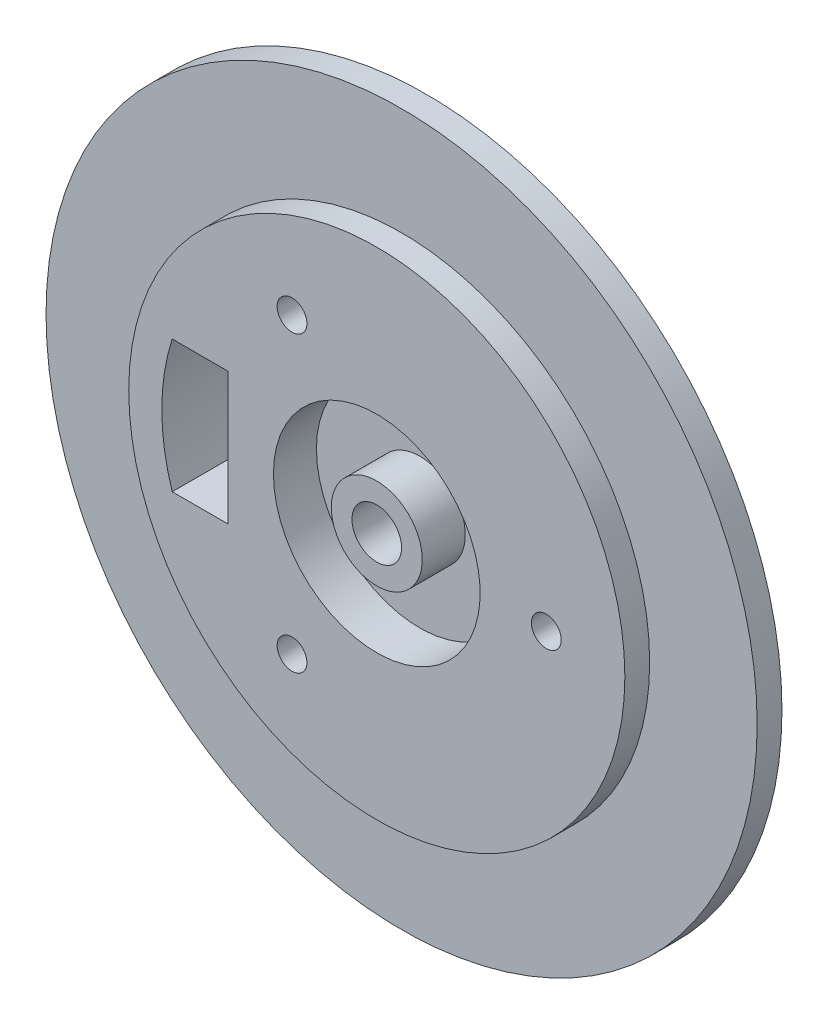
ISO-10303-21;
HEADER;
FILE_DESCRIPTION(('STEP AP214'),'2;1');
FILE_NAME('part.step','',(''),(''),'','','');
FILE_SCHEMA(('AUTOMOTIVE_DESIGN { 1 0 10303 214 1 1 1 1 }'));
ENDSEC;
DATA;
#1=APPLICATION_CONTEXT('core data for automotive mechanical design processes');
#2=APPLICATION_PROTOCOL_DEFINITION('international standard','automotive_design',2000,#1);
#3=PRODUCT_CONTEXT('',#1,'mechanical');
#4=PRODUCT('Part','Part','',(#3));
#5=PRODUCT_RELATED_PRODUCT_CATEGORY('part','',(#4));
#6=PRODUCT_DEFINITION_FORMATION('','',#4);
#7=PRODUCT_DEFINITION_CONTEXT('part definition',#1,'design');
#8=PRODUCT_DEFINITION('design','',#6,#7);
#9=PRODUCT_DEFINITION_SHAPE('','',#8);
#10=(LENGTH_UNIT() NAMED_UNIT(*) SI_UNIT(.MILLI.,.METRE.));
#11=(NAMED_UNIT(*) PLANE_ANGLE_UNIT() SI_UNIT($,.RADIAN.));
#12=(NAMED_UNIT(*) SI_UNIT($,.STERADIAN.) SOLID_ANGLE_UNIT());
#13=UNCERTAINTY_MEASURE_WITH_UNIT(LENGTH_MEASURE(1.E-05),#10,'distance_accuracy_value','');
#14=(GEOMETRIC_REPRESENTATION_CONTEXT(3) GLOBAL_UNCERTAINTY_ASSIGNED_CONTEXT((#13)) GLOBAL_UNIT_ASSIGNED_CONTEXT((#10,
#11,#12)) REPRESENTATION_CONTEXT('',''));
#15=CARTESIAN_POINT('',(0.,0.,0.));
#16=DIRECTION('',(0.,0.,1.));
#17=DIRECTION('',(1.,0.,0.));
#18=AXIS2_PLACEMENT_3D('',#15,#16,#17);
#19=CARTESIAN_POINT('',(0.,0.,3.4));
#20=DIRECTION('',(0.,0.,1.));
#21=DIRECTION('',(1.,0.,0.));
#22=AXIS2_PLACEMENT_3D('',#19,#20,#21);
#23=CYLINDRICAL_SURFACE('',#22,2.75);
#24=DIRECTION('',(0.,0.,-1.));
#25=VECTOR('',#24,1.);
#26=CARTESIAN_POINT('',(-2.75,0.,3.4));
#27=LINE('',#26,#25);
#28=CARTESIAN_POINT('',(-2.75,0.,6.));
#29=VERTEX_POINT('',#28);
#30=CARTESIAN_POINT('',(-2.75,0.,3.4));
#31=VERTEX_POINT('',#30);
#32=EDGE_CURVE('E364',#29,#31,#27,.T.);
#33=ORIENTED_EDGE('',*,*,#32,.F.);
#34=CARTESIAN_POINT('',(0.,0.,6.));
#35=DIRECTION('',(0.,0.,1.));
#36=DIRECTION('',(1.,0.,0.));
#37=AXIS2_PLACEMENT_3D('',#34,#35,#36);
#38=CIRCLE('',#37,2.75);
#39=EDGE_CURVE('E63',#29,#29,#38,.F.);
#40=ORIENTED_EDGE('',*,*,#39,.T.);
#41=ORIENTED_EDGE('',*,*,#32,.T.);
#42=CARTESIAN_POINT('',(0.,0.,3.4));
#43=DIRECTION('',(0.,0.,-1.));
#44=DIRECTION('',(1.,0.,0.));
#45=AXIS2_PLACEMENT_3D('',#42,#43,#44);
#46=CIRCLE('',#45,2.75);
#47=EDGE_CURVE('E406',#31,#31,#46,.T.);
#48=ORIENTED_EDGE('',*,*,#47,.F.);
#49=EDGE_LOOP('',(#33,#40,#41,#48));
#50=FACE_BOUND('',#49,.T.);
#51=ADVANCED_FACE('F47',(#50),#23,.T.);
#52=CARTESIAN_POINT('',(0.,0.,0.));
#53=DIRECTION('',(0.,0.,1.));
#54=DIRECTION('',(1.,0.,0.));
#55=AXIS2_PLACEMENT_3D('',#52,#53,#54);
#56=CYLINDRICAL_SURFACE('',#55,1.5);
#57=CARTESIAN_POINT('',(0.,0.,6.));
#58=DIRECTION('',(0.,0.,1.));
#59=DIRECTION('',(1.,0.,0.));
#60=AXIS2_PLACEMENT_3D('',#57,#58,#59);
#61=CIRCLE('',#60,1.5);
#62=CARTESIAN_POINT('',(-1.5,0.,6.));
#63=VERTEX_POINT('',#62);
#64=EDGE_CURVE('E51',#63,#63,#61,.F.);
#65=ORIENTED_EDGE('',*,*,#64,.F.);
#66=DIRECTION('',(0.,0.,-1.));
#67=VECTOR('',#66,1.);
#68=CARTESIAN_POINT('',(-1.5,0.,0.));
#69=LINE('',#68,#67);
#70=CARTESIAN_POINT('',(-1.5,0.,1.9));
#71=VERTEX_POINT('',#70);
#72=EDGE_CURVE('E348',#63,#71,#69,.T.);
#73=ORIENTED_EDGE('',*,*,#72,.T.);
#74=CARTESIAN_POINT('',(0.,0.,1.9));
#75=DIRECTION('',(0.,0.,-1.));
#76=DIRECTION('',(1.,0.,0.));
#77=AXIS2_PLACEMENT_3D('',#74,#75,#76);
#78=CIRCLE('',#77,1.5);
#79=CARTESIAN_POINT('',(-1.06066017177982,1.06066017177982,1.9));
#80=VERTEX_POINT('',#79);
#81=EDGE_CURVE('E343',#71,#80,#78,.T.);
#82=ORIENTED_EDGE('',*,*,#81,.T.);
#83=DIRECTION('',(0.,0.,-1.));
#84=VECTOR('',#83,1.);
#85=CARTESIAN_POINT('',(-1.06066017177982,1.06066017177982,0.));
#86=LINE('',#85,#84);
#87=CARTESIAN_POINT('',(-1.06066017177982,1.06066017177982,2.7));
#88=VERTEX_POINT('',#87);
#89=EDGE_CURVE('E347',#88,#80,#86,.T.);
#90=ORIENTED_EDGE('',*,*,#89,.F.);
#91=CARTESIAN_POINT('',(0.,0.,2.7));
#92=DIRECTION('',(0.,0.,-1.));
#93=DIRECTION('',(1.,0.,0.));
#94=AXIS2_PLACEMENT_3D('',#91,#92,#93);
#95=CIRCLE('',#94,1.5);
#96=CARTESIAN_POINT('',(1.06066017177982,-1.06066017177982,2.7));
#97=VERTEX_POINT('',#96);
#98=EDGE_CURVE('E295',#88,#97,#95,.T.);
#99=ORIENTED_EDGE('',*,*,#98,.T.);
#100=DIRECTION('',(0.,0.,-1.));
#101=VECTOR('',#100,1.);
#102=CARTESIAN_POINT('',(1.06066017177982,-1.06066017177982,0.));
#103=LINE('',#102,#101);
#104=CARTESIAN_POINT('',(1.06066017177982,-1.06066017177982,1.9));
#105=VERTEX_POINT('',#104);
#106=EDGE_CURVE('E291',#97,#105,#103,.T.);
#107=ORIENTED_EDGE('',*,*,#106,.T.);
#108=CARTESIAN_POINT('',(0.,0.,1.9));
#109=DIRECTION('',(0.,0.,-1.));
#110=DIRECTION('',(1.,0.,0.));
#111=AXIS2_PLACEMENT_3D('',#108,#109,#110);
#112=CIRCLE('',#111,1.5);
#113=EDGE_CURVE('E294',#105,#71,#112,.T.);
#114=ORIENTED_EDGE('',*,*,#113,.T.);
#115=ORIENTED_EDGE('',*,*,#72,.F.);
#116=EDGE_LOOP('',(#65,#73,#82,#90,#99,#107,#114,#115));
#117=FACE_BOUND('',#116,.T.);
#118=ADVANCED_FACE('F572',(#117),#56,.F.);
#119=CARTESIAN_POINT('',(0.,0.,0.));
#120=DIRECTION('',(0.,0.,1.));
#121=DIRECTION('',(1.,0.,0.));
#122=AXIS2_PLACEMENT_3D('',#119,#120,#121);
#123=PLANE('',#122);
#124=CARTESIAN_POINT('',(0.,0.,0.));
#125=DIRECTION('',(0.,0.,-1.));
#126=DIRECTION('',(1.,0.,0.));
#127=AXIS2_PLACEMENT_3D('',#124,#125,#126);
#128=CIRCLE('',#127,13.);
#129=CARTESIAN_POINT('',(-12.369316876853,-4.,0.));
#130=VERTEX_POINT('',#129);
#131=CARTESIAN_POINT('',(-12.369316876853,4.,0.));
#132=VERTEX_POINT('',#131);
#133=EDGE_CURVE('E274',#130,#132,#128,.T.);
#134=ORIENTED_EDGE('',*,*,#133,.F.);
#135=DIRECTION('',(-1.,0.,0.));
#136=VECTOR('',#135,1.);
#137=CARTESIAN_POINT('',(-8.99999999999928,-4.,0.));
#138=LINE('',#137,#136);
#139=CARTESIAN_POINT('',(-8.99999999999928,-4.,0.));
#140=VERTEX_POINT('',#139);
#141=EDGE_CURVE('E316',#140,#130,#138,.T.);
#142=ORIENTED_EDGE('',*,*,#141,.F.);
#143=DIRECTION('',(1.7874590696465E-13,-1.,0.));
#144=VECTOR('',#143,1.);
#145=CARTESIAN_POINT('',(-9.00000000000071,4.,0.));
#146=LINE('',#145,#144);
#147=CARTESIAN_POINT('',(-9.00000000000071,4.,0.));
#148=VERTEX_POINT('',#147);
#149=EDGE_CURVE('E388',#148,#140,#146,.T.);
#150=ORIENTED_EDGE('',*,*,#149,.F.);
#151=DIRECTION('',(1.,0.,0.));
#152=VECTOR('',#151,1.);
#153=CARTESIAN_POINT('',(-18.6455305960568,4.,0.));
#154=LINE('',#153,#152);
#155=EDGE_CURVE('E387',#132,#148,#154,.T.);
#156=ORIENTED_EDGE('',*,*,#155,.F.);
#157=EDGE_LOOP('',(#134,#142,#150,#156));
#158=FACE_BOUND('',#157,.T.);
#159=CARTESIAN_POINT('',(10.2508540294594,-4.2398119126906E-12,0.));
#160=DIRECTION('',(0.,0.,-1.));
#161=DIRECTION('',(1.,0.,0.));
#162=AXIS2_PLACEMENT_3D('',#159,#160,#161);
#163=CIRCLE('',#162,0.9);
#164=CARTESIAN_POINT('',(9.35085402945935,-4.23992213090252E-12,0.));
#165=VERTEX_POINT('',#164);
#166=EDGE_CURVE('E259',#165,#165,#163,.T.);
#167=ORIENTED_EDGE('',*,*,#166,.F.);
#168=EDGE_LOOP('',(#167));
#169=FACE_BOUND('',#168,.T.);
#170=CARTESIAN_POINT('',(-5.12542701473091,-8.8775,0.));
#171=DIRECTION('',(0.,0.,-1.));
#172=DIRECTION('',(1.,0.,0.));
#173=AXIS2_PLACEMENT_3D('',#170,#171,#172);
#174=CIRCLE('',#173,0.9);
#175=CARTESIAN_POINT('',(-6.02542701473092,-8.8775,0.));
#176=VERTEX_POINT('',#175);
#177=EDGE_CURVE('E272',#176,#176,#174,.T.);
#178=ORIENTED_EDGE('',*,*,#177,.F.);
#179=EDGE_LOOP('',(#178));
#180=FACE_BOUND('',#179,.T.);
#181=CARTESIAN_POINT('',(-5.12542701473091,8.8775,0.));
#182=DIRECTION('',(0.,0.,-1.));
#183=DIRECTION('',(1.,0.,0.));
#184=AXIS2_PLACEMENT_3D('',#181,#182,#183);
#185=CIRCLE('',#184,0.9);
#186=CARTESIAN_POINT('',(-6.02542701473091,8.8775,0.));
#187=VERTEX_POINT('',#186);
#188=EDGE_CURVE('E57',#187,#187,#185,.T.);
#189=ORIENTED_EDGE('',*,*,#188,.F.);
#190=EDGE_LOOP('',(#189));
#191=FACE_BOUND('',#190,.T.);
#192=DIRECTION('',(0.,1.,0.));
#193=VECTOR('',#192,1.);
#194=CARTESIAN_POINT('',(3.50000000000044,-2.12499999999984,0.));
#195=LINE('',#194,#193);
#196=CARTESIAN_POINT('',(3.50000000000044,-4.24999999999969,0.));
#197=VERTEX_POINT('',#196);
#198=CARTESIAN_POINT('',(3.50000000000044,1.37867965644079,0.));
#199=VERTEX_POINT('',#198);
#200=EDGE_CURVE('E367',#197,#199,#195,.T.);
#201=ORIENTED_EDGE('',*,*,#200,.T.);
#202=DIRECTION('',(0.707106781186548,0.707106781186547,0.));
#203=VECTOR('',#202,1.);
#204=CARTESIAN_POINT('',(1.06066017177982,-1.06066017177982,0.));
#205=LINE('',#204,#203);
#206=CARTESIAN_POINT('',(8.13172798365366,6.01040764009402,0.));
#207=VERTEX_POINT('',#206);
#208=EDGE_CURVE('E379',#199,#207,#205,.T.);
#209=ORIENTED_EDGE('',*,*,#208,.T.);
#210=CARTESIAN_POINT('',(7.07106781187384,7.07106781187384,0.));
#211=DIRECTION('',(0.,0.,1.));
#212=DIRECTION('',(1.,0.,0.));
#213=AXIS2_PLACEMENT_3D('',#210,#211,#212);
#214=CIRCLE('',#213,1.5);
#215=CARTESIAN_POINT('',(6.01040764009402,8.13172798365366,0.));
#216=VERTEX_POINT('',#215);
#217=EDGE_CURVE('E426',#207,#216,#214,.T.);
#218=ORIENTED_EDGE('',*,*,#217,.T.);
#219=DIRECTION('',(-0.707106781186548,-0.707106781186547,0.));
#220=VECTOR('',#219,1.);
#221=CARTESIAN_POINT('',(2.4748737341571,4.59619407771674,0.));
#222=LINE('',#221,#220);
#223=CARTESIAN_POINT('',(2.12867965644067,4.25000000000031,0.));
#224=VERTEX_POINT('',#223);
#225=EDGE_CURVE('E383',#216,#224,#222,.T.);
#226=ORIENTED_EDGE('',*,*,#225,.T.);
#227=DIRECTION('',(-1.,0.,0.));
#228=VECTOR('',#227,1.);
#229=CARTESIAN_POINT('',(1.75000000000022,4.25000000000031,0.));
#230=LINE('',#229,#228);
#231=CARTESIAN_POINT('',(-3.49999999999956,4.25000000000031,0.));
#232=VERTEX_POINT('',#231);
#233=EDGE_CURVE('E289',#224,#232,#230,.T.);
#234=ORIENTED_EDGE('',*,*,#233,.T.);
#235=DIRECTION('',(0.,-1.,0.));
#236=VECTOR('',#235,1.);
#237=CARTESIAN_POINT('',(-3.49999999999956,2.12500000000016,0.));
#238=LINE('',#237,#236);
#239=CARTESIAN_POINT('',(-3.49999999999956,-4.24999999999969,0.));
#240=VERTEX_POINT('',#239);
#241=EDGE_CURVE('E378',#232,#240,#238,.T.);
#242=ORIENTED_EDGE('',*,*,#241,.T.);
#243=DIRECTION('',(1.,0.,0.));
#244=VECTOR('',#243,1.);
#245=CARTESIAN_POINT('',(-1.74999999999978,-4.24999999999969,0.));
#246=LINE('',#245,#244);
#247=EDGE_CURVE('E377',#240,#197,#246,.T.);
#248=ORIENTED_EDGE('',*,*,#247,.T.);
#249=EDGE_LOOP('',(#201,#209,#218,#226,#234,#242,#248));
#250=FACE_BOUND('',#249,.T.);
#251=CARTESIAN_POINT('',(0.,0.,0.));
#252=DIRECTION('',(0.,0.,1.));
#253=DIRECTION('',(1.,0.,0.));
#254=AXIS2_PLACEMENT_3D('',#251,#252,#253);
#255=CIRCLE('',#254,15.);
#256=CARTESIAN_POINT('',(-15.,0.,0.));
#257=VERTEX_POINT('',#256);
#258=EDGE_CURVE('E349',#257,#257,#255,.T.);
#259=ORIENTED_EDGE('',*,*,#258,.F.);
#260=EDGE_LOOP('',(#259));
#261=FACE_BOUND('',#260,.T.);
#262=ADVANCED_FACE('F542',(#158,#169,#180,#191,#250,#261),#123,.F.);
#263=CARTESIAN_POINT('',(0.,0.,3.4));
#264=DIRECTION('',(0.,0.,1.));
#265=DIRECTION('',(1.,0.,0.));
#266=AXIS2_PLACEMENT_3D('',#263,#264,#265);
#267=PLANE('',#266);
#268=ORIENTED_EDGE('',*,*,#47,.T.);
#269=EDGE_LOOP('',(#268));
#270=FACE_BOUND('',#269,.T.);
#271=CARTESIAN_POINT('',(0.,0.,3.4));
#272=DIRECTION('',(0.,0.,1.));
#273=DIRECTION('',(1.,0.,0.));
#274=AXIS2_PLACEMENT_3D('',#271,#272,#273);
#275=CIRCLE('',#274,6.25);
#276=CARTESIAN_POINT('',(-6.25,0.,3.4));
#277=VERTEX_POINT('',#276);
#278=EDGE_CURVE('E400',#277,#277,#275,.T.);
#279=ORIENTED_EDGE('',*,*,#278,.T.);
#280=EDGE_LOOP('',(#279));
#281=FACE_BOUND('',#280,.T.);
#282=ADVANCED_FACE('F625',(#270,#281),#267,.T.);
#283=CARTESIAN_POINT('',(0.,0.,0.));
#284=DIRECTION('',(0.,0.,1.));
#285=DIRECTION('',(1.,0.,0.));
#286=AXIS2_PLACEMENT_3D('',#283,#284,#285);
#287=CYLINDRICAL_SURFACE('',#286,15.);
#288=CARTESIAN_POINT('',(0.,0.,6.));
#289=DIRECTION('',(0.,0.,1.));
#290=DIRECTION('',(1.,0.,0.));
#291=AXIS2_PLACEMENT_3D('',#288,#289,#290);
#292=CIRCLE('',#291,15.);
#293=CARTESIAN_POINT('',(-15.,0.,6.));
#294=VERTEX_POINT('',#293);
#295=EDGE_CURVE('E395',#294,#294,#292,.T.);
#296=ORIENTED_EDGE('',*,*,#295,.F.);
#297=DIRECTION('',(0.,0.,-1.));
#298=VECTOR('',#297,1.);
#299=CARTESIAN_POINT('',(-15.,0.,0.));
#300=LINE('',#299,#298);
#301=CARTESIAN_POINT('',(-15.,0.,4.5));
#302=VERTEX_POINT('',#301);
#303=EDGE_CURVE('E11',#294,#302,#300,.T.);
#304=ORIENTED_EDGE('',*,*,#303,.T.);
#305=CARTESIAN_POINT('',(0.,0.,4.5));
#306=DIRECTION('',(0.,0.,1.));
#307=DIRECTION('',(1.,0.,0.));
#308=AXIS2_PLACEMENT_3D('',#305,#306,#307);
#309=CIRCLE('',#308,15.);
#310=EDGE_CURVE('E368',#302,#302,#309,.T.);
#311=ORIENTED_EDGE('',*,*,#310,.T.);
#312=ORIENTED_EDGE('',*,*,#303,.F.);
#313=EDGE_LOOP('',(#296,#304,#311,#312));
#314=FACE_BOUND('',#313,.T.);
#315=ADVANCED_FACE('F628',(#314),#287,.T.);
#316=CARTESIAN_POINT('',(-5.12542701473091,8.8775,0.));
#317=DIRECTION('',(0.,0.,1.));
#318=DIRECTION('',(1.,0.,0.));
#319=AXIS2_PLACEMENT_3D('',#316,#317,#318);
#320=CYLINDRICAL_SURFACE('',#319,0.9);
#321=CARTESIAN_POINT('',(-5.12542701473091,8.8775,6.));
#322=DIRECTION('',(0.,0.,-1.));
#323=DIRECTION('',(1.,0.,0.));
#324=AXIS2_PLACEMENT_3D('',#321,#322,#323);
#325=CIRCLE('',#324,0.9);
#326=CARTESIAN_POINT('',(-6.02542701473091,8.8775,6.));
#327=VERTEX_POINT('',#326);
#328=EDGE_CURVE('E280',#327,#327,#325,.T.);
#329=ORIENTED_EDGE('',*,*,#328,.F.);
#330=DIRECTION('',(0.,0.,-1.));
#331=VECTOR('',#330,1.);
#332=CARTESIAN_POINT('',(-6.02542701473091,8.8775,0.));
#333=LINE('',#332,#331);
#334=EDGE_CURVE('E299',#327,#187,#333,.T.);
#335=ORIENTED_EDGE('',*,*,#334,.T.);
#336=ORIENTED_EDGE('',*,*,#188,.T.);
#337=ORIENTED_EDGE('',*,*,#334,.F.);
#338=EDGE_LOOP('',(#329,#335,#336,#337));
#339=FACE_BOUND('',#338,.T.);
#340=ADVANCED_FACE('F643',(#339),#320,.F.);
#341=CARTESIAN_POINT('',(-5.12542701473091,-8.8775,0.));
#342=DIRECTION('',(0.,0.,1.));
#343=DIRECTION('',(1.,0.,0.));
#344=AXIS2_PLACEMENT_3D('',#341,#342,#343);
#345=CYLINDRICAL_SURFACE('',#344,0.9);
#346=CARTESIAN_POINT('',(-5.12542701473091,-8.8775,6.));
#347=DIRECTION('',(0.,0.,-1.));
#348=DIRECTION('',(1.,0.,0.));
#349=AXIS2_PLACEMENT_3D('',#346,#347,#348);
#350=CIRCLE('',#349,0.9);
#351=CARTESIAN_POINT('',(-6.02542701473092,-8.8775,6.));
#352=VERTEX_POINT('',#351);
#353=EDGE_CURVE('E321',#352,#352,#350,.T.);
#354=ORIENTED_EDGE('',*,*,#353,.F.);
#355=DIRECTION('',(0.,0.,-1.));
#356=VECTOR('',#355,1.);
#357=CARTESIAN_POINT('',(-6.02542701473092,-8.8775,0.));
#358=LINE('',#357,#356);
#359=EDGE_CURVE('E266',#352,#176,#358,.T.);
#360=ORIENTED_EDGE('',*,*,#359,.T.);
#361=ORIENTED_EDGE('',*,*,#177,.T.);
#362=ORIENTED_EDGE('',*,*,#359,.F.);
#363=EDGE_LOOP('',(#354,#360,#361,#362));
#364=FACE_BOUND('',#363,.T.);
#365=ADVANCED_FACE('F640',(#364),#345,.F.);
#366=CARTESIAN_POINT('',(10.2508540294594,-4.2398119126906E-12,0.));
#367=DIRECTION('',(0.,0.,1.));
#368=DIRECTION('',(1.,0.,0.));
#369=AXIS2_PLACEMENT_3D('',#366,#367,#368);
#370=CYLINDRICAL_SURFACE('',#369,0.9);
#371=CARTESIAN_POINT('',(10.2508540294594,-4.2398119126906E-12,6.));
#372=DIRECTION('',(0.,0.,-1.));
#373=DIRECTION('',(1.,0.,0.));
#374=AXIS2_PLACEMENT_3D('',#371,#372,#373);
#375=CIRCLE('',#374,0.9);
#376=CARTESIAN_POINT('',(9.35085402945935,-4.23994173104347E-12,6.));
#377=VERTEX_POINT('',#376);
#378=EDGE_CURVE('E284',#377,#377,#375,.T.);
#379=ORIENTED_EDGE('',*,*,#378,.F.);
#380=DIRECTION('',(0.,0.,-1.));
#381=VECTOR('',#380,1.);
#382=CARTESIAN_POINT('',(9.35085402945935,-4.23992213090252E-12,0.));
#383=LINE('',#382,#381);
#384=EDGE_CURVE('E262',#377,#165,#383,.T.);
#385=ORIENTED_EDGE('',*,*,#384,.T.);
#386=ORIENTED_EDGE('',*,*,#166,.T.);
#387=ORIENTED_EDGE('',*,*,#384,.F.);
#388=EDGE_LOOP('',(#379,#385,#386,#387));
#389=FACE_BOUND('',#388,.T.);
#390=ADVANCED_FACE('F261',(#389),#370,.F.);
#391=CARTESIAN_POINT('',(0.,0.,0.));
#392=DIRECTION('',(0.,0.,1.));
#393=DIRECTION('',(-1.,0.,0.));
#394=AXIS2_PLACEMENT_3D('',#391,#392,#393);
#395=CYLINDRICAL_SURFACE('',#394,13.);
#396=ORIENTED_EDGE('',*,*,#133,.T.);
#397=DIRECTION('',(0.,0.,1.));
#398=VECTOR('',#397,1.);
#399=CARTESIAN_POINT('',(-12.369316876853,4.,0.));
#400=LINE('',#399,#398);
#401=CARTESIAN_POINT('',(-12.369316876853,4.,6.));
#402=VERTEX_POINT('',#401);
#403=EDGE_CURVE('E336',#132,#402,#400,.T.);
#404=ORIENTED_EDGE('',*,*,#403,.T.);
#405=CARTESIAN_POINT('',(0.,0.,6.));
#406=DIRECTION('',(0.,0.,-1.));
#407=DIRECTION('',(1.,0.,0.));
#408=AXIS2_PLACEMENT_3D('',#405,#406,#407);
#409=CIRCLE('',#408,13.);
#410=CARTESIAN_POINT('',(-12.369316876853,-4.,6.));
#411=VERTEX_POINT('',#410);
#412=EDGE_CURVE('E357',#411,#402,#409,.T.);
#413=ORIENTED_EDGE('',*,*,#412,.F.);
#414=DIRECTION('',(0.,0.,1.));
#415=VECTOR('',#414,1.);
#416=CARTESIAN_POINT('',(-12.369316876853,-4.,0.));
#417=LINE('',#416,#415);
#418=EDGE_CURVE('E320',#130,#411,#417,.T.);
#419=ORIENTED_EDGE('',*,*,#418,.F.);
#420=EDGE_LOOP('',(#396,#404,#413,#419));
#421=FACE_BOUND('',#420,.T.);
#422=ADVANCED_FACE('F633',(#421),#395,.F.);
#423=CARTESIAN_POINT('',(-12.369316876853,4.,0.));
#424=DIRECTION('',(0.,-1.,0.));
#425=DIRECTION('',(0.,0.,-1.));
#426=AXIS2_PLACEMENT_3D('',#423,#424,#425);
#427=PLANE('',#426);
#428=ORIENTED_EDGE('',*,*,#155,.T.);
#429=DIRECTION('',(0.,0.,1.));
#430=VECTOR('',#429,1.);
#431=CARTESIAN_POINT('',(-9.00000000000071,4.,0.));
#432=LINE('',#431,#430);
#433=CARTESIAN_POINT('',(-9.00000000000071,4.,6.));
#434=VERTEX_POINT('',#433);
#435=EDGE_CURVE('E384',#148,#434,#432,.T.);
#436=ORIENTED_EDGE('',*,*,#435,.T.);
#437=DIRECTION('',(1.,0.,0.));
#438=VECTOR('',#437,1.);
#439=CARTESIAN_POINT('',(-6.18465843842649,4.,6.));
#440=LINE('',#439,#438);
#441=EDGE_CURVE('E353',#402,#434,#440,.T.);
#442=ORIENTED_EDGE('',*,*,#441,.F.);
#443=ORIENTED_EDGE('',*,*,#403,.F.);
#444=EDGE_LOOP('',(#428,#436,#442,#443));
#445=FACE_BOUND('',#444,.T.);
#446=ADVANCED_FACE('F630',(#445),#427,.T.);
#447=CARTESIAN_POINT('',(-9.00000000000071,4.,0.));
#448=DIRECTION('',(-1.,-1.7874590696465E-13,0.));
#449=DIRECTION('',(-1.7874590696465E-13,1.,0.));
#450=AXIS2_PLACEMENT_3D('',#447,#448,#449);
#451=PLANE('',#450);
#452=ORIENTED_EDGE('',*,*,#149,.T.);
#453=DIRECTION('',(0.,0.,1.));
#454=VECTOR('',#453,1.);
#455=CARTESIAN_POINT('',(-8.99999999999928,-4.,0.));
#456=LINE('',#455,#454);
#457=CARTESIAN_POINT('',(-8.99999999999928,-4.,6.));
#458=VERTEX_POINT('',#457);
#459=EDGE_CURVE('E360',#140,#458,#456,.T.);
#460=ORIENTED_EDGE('',*,*,#459,.T.);
#461=DIRECTION('',(1.7874590696465E-13,-1.,0.));
#462=VECTOR('',#461,1.);
#463=CARTESIAN_POINT('',(-9.00000000000036,1.9999999999992,6.));
#464=LINE('',#463,#462);
#465=EDGE_CURVE('E285',#434,#458,#464,.T.);
#466=ORIENTED_EDGE('',*,*,#465,.F.);
#467=ORIENTED_EDGE('',*,*,#435,.F.);
#468=EDGE_LOOP('',(#452,#460,#466,#467));
#469=FACE_BOUND('',#468,.T.);
#470=ADVANCED_FACE('F632',(#469),#451,.T.);
#471=CARTESIAN_POINT('',(-8.99999999999928,-4.,0.));
#472=DIRECTION('',(0.,1.,0.));
#473=DIRECTION('',(1.,0.,0.));
#474=AXIS2_PLACEMENT_3D('',#471,#472,#473);
#475=PLANE('',#474);
#476=ORIENTED_EDGE('',*,*,#141,.T.);
#477=ORIENTED_EDGE('',*,*,#418,.T.);
#478=DIRECTION('',(-1.,0.,0.));
#479=VECTOR('',#478,1.);
#480=CARTESIAN_POINT('',(-4.49999999999964,-4.,6.));
#481=LINE('',#480,#479);
#482=EDGE_CURVE('E399',#458,#411,#481,.T.);
#483=ORIENTED_EDGE('',*,*,#482,.F.);
#484=ORIENTED_EDGE('',*,*,#459,.F.);
#485=EDGE_LOOP('',(#476,#477,#483,#484));
#486=FACE_BOUND('',#485,.T.);
#487=ADVANCED_FACE('F674',(#486),#475,.T.);
#488=CARTESIAN_POINT('',(0.,0.,6.));
#489=DIRECTION('',(0.,0.,1.));
#490=DIRECTION('',(1.,0.,0.));
#491=AXIS2_PLACEMENT_3D('',#488,#489,#490);
#492=PLANE('',#491);
#493=CARTESIAN_POINT('',(0.,0.,6.));
#494=DIRECTION('',(0.,0.,-1.));
#495=DIRECTION('',(1.,0.,0.));
#496=AXIS2_PLACEMENT_3D('',#493,#494,#495);
#497=CIRCLE('',#496,6.25);
#498=CARTESIAN_POINT('',(-6.25,0.,6.));
#499=VERTEX_POINT('',#498);
#500=EDGE_CURVE('E425',#499,#499,#497,.T.);
#501=ORIENTED_EDGE('',*,*,#500,.T.);
#502=EDGE_LOOP('',(#501));
#503=FACE_BOUND('',#502,.T.);
#504=ORIENTED_EDGE('',*,*,#353,.T.);
#505=EDGE_LOOP('',(#504));
#506=FACE_BOUND('',#505,.T.);
#507=ORIENTED_EDGE('',*,*,#378,.T.);
#508=EDGE_LOOP('',(#507));
#509=FACE_BOUND('',#508,.T.);
#510=ORIENTED_EDGE('',*,*,#328,.T.);
#511=EDGE_LOOP('',(#510));
#512=FACE_BOUND('',#511,.T.);
#513=ORIENTED_EDGE('',*,*,#482,.T.);
#514=ORIENTED_EDGE('',*,*,#412,.T.);
#515=ORIENTED_EDGE('',*,*,#441,.T.);
#516=ORIENTED_EDGE('',*,*,#465,.T.);
#517=EDGE_LOOP('',(#513,#514,#515,#516));
#518=FACE_BOUND('',#517,.T.);
#519=ORIENTED_EDGE('',*,*,#295,.T.);
#520=EDGE_LOOP('',(#519));
#521=FACE_BOUND('',#520,.T.);
#522=ADVANCED_FACE('F49',(#503,#506,#509,#512,#518,#521),#492,.T.);
#523=CARTESIAN_POINT('',(0.,0.,3.4));
#524=DIRECTION('',(0.,0.,1.));
#525=DIRECTION('',(1.,0.,0.));
#526=AXIS2_PLACEMENT_3D('',#523,#524,#525);
#527=CYLINDRICAL_SURFACE('',#526,6.25);
#528=ORIENTED_EDGE('',*,*,#500,.F.);
#529=DIRECTION('',(0.,0.,-1.));
#530=VECTOR('',#529,1.);
#531=CARTESIAN_POINT('',(-6.25,0.,3.4));
#532=LINE('',#531,#530);
#533=EDGE_CURVE('E277',#499,#277,#532,.T.);
#534=ORIENTED_EDGE('',*,*,#533,.T.);
#535=ORIENTED_EDGE('',*,*,#278,.F.);
#536=ORIENTED_EDGE('',*,*,#533,.F.);
#537=EDGE_LOOP('',(#528,#534,#535,#536));
#538=FACE_BOUND('',#537,.T.);
#539=ADVANCED_FACE('F622',(#538),#527,.F.);
#540=CARTESIAN_POINT('',(3.75520382004701,3.75520382004701,2.7));
#541=DIRECTION('',(0.,0.,1.));
#542=DIRECTION('',(1.,0.,0.));
#543=AXIS2_PLACEMENT_3D('',#540,#541,#542);
#544=PLANE('',#543);
#545=CARTESIAN_POINT('',(7.07106781187384,7.07106781187384,2.7));
#546=DIRECTION('',(0.,0.,1.));
#547=DIRECTION('',(1.,0.,0.));
#548=AXIS2_PLACEMENT_3D('',#545,#546,#547);
#549=CIRCLE('',#548,1.5);
#550=CARTESIAN_POINT('',(8.13172798365366,6.01040764009402,2.7));
#551=VERTEX_POINT('',#550);
#552=CARTESIAN_POINT('',(6.01040764009402,8.13172798365366,2.7));
#553=VERTEX_POINT('',#552);
#554=EDGE_CURVE('E422',#551,#553,#549,.T.);
#555=ORIENTED_EDGE('',*,*,#554,.F.);
#556=DIRECTION('',(0.707106781186548,0.707106781186547,0.));
#557=VECTOR('',#556,1.);
#558=CARTESIAN_POINT('',(8.13172798365366,6.01040764009402,2.7));
#559=LINE('',#558,#557);
#560=EDGE_CURVE('E300',#97,#551,#559,.T.);
#561=ORIENTED_EDGE('',*,*,#560,.F.);
#562=ORIENTED_EDGE('',*,*,#98,.F.);
#563=DIRECTION('',(-0.707106781186548,-0.707106781186547,0.));
#564=VECTOR('',#563,1.);
#565=CARTESIAN_POINT('',(-1.06066017177982,1.06066017177982,2.7));
#566=LINE('',#565,#564);
#567=EDGE_CURVE('E431',#553,#88,#566,.T.);
#568=ORIENTED_EDGE('',*,*,#567,.F.);
#569=EDGE_LOOP('',(#555,#561,#562,#568));
#570=FACE_BOUND('',#569,.T.);
#571=ADVANCED_FACE('F570',(#570),#544,.F.);
#572=CARTESIAN_POINT('',(7.07106781187384,7.07106781187384,0.));
#573=DIRECTION('',(0.,0.,1.));
#574=DIRECTION('',(1.,0.,0.));
#575=AXIS2_PLACEMENT_3D('',#572,#573,#574);
#576=CYLINDRICAL_SURFACE('',#575,1.5);
#577=ORIENTED_EDGE('',*,*,#217,.F.);
#578=DIRECTION('',(0.,0.,1.));
#579=VECTOR('',#578,1.);
#580=CARTESIAN_POINT('',(8.13172798365366,6.01040764009402,0.));
#581=LINE('',#580,#579);
#582=EDGE_CURVE('E304',#207,#551,#581,.T.);
#583=ORIENTED_EDGE('',*,*,#582,.T.);
#584=ORIENTED_EDGE('',*,*,#554,.T.);
#585=DIRECTION('',(0.,0.,1.));
#586=VECTOR('',#585,1.);
#587=CARTESIAN_POINT('',(6.01040764009402,8.13172798365366,0.));
#588=LINE('',#587,#586);
#589=EDGE_CURVE('E427',#216,#553,#588,.T.);
#590=ORIENTED_EDGE('',*,*,#589,.F.);
#591=EDGE_LOOP('',(#577,#583,#584,#590));
#592=FACE_BOUND('',#591,.T.);
#593=ADVANCED_FACE('F565',(#592),#576,.F.);
#594=CARTESIAN_POINT('',(6.01040764009402,8.13172798365366,0.));
#595=DIRECTION('',(-0.707106781186547,0.707106781186548,0.));
#596=DIRECTION('',(0.,0.,1.));
#597=AXIS2_PLACEMENT_3D('',#594,#595,#596);
#598=PLANE('',#597);
#599=DIRECTION('',(0.707106781186548,0.707106781186547,0.));
#600=VECTOR('',#599,1.);
#601=CARTESIAN_POINT('',(2.47487373415729,4.59619407771693,1.9));
#602=LINE('',#601,#600);
#603=CARTESIAN_POINT('',(1.12867965644067,3.25000000000031,1.9));
#604=VERTEX_POINT('',#603);
#605=EDGE_CURVE('E329',#80,#604,#602,.T.);
#606=ORIENTED_EDGE('',*,*,#605,.T.);
#607=DIRECTION('',(-0.650944554904119,-0.650944554904119,0.390566732942472));
#608=VECTOR('',#607,1.);
#609=CARTESIAN_POINT('',(3.71443734942085,5.83575769298049,0.34854538421189));
#610=LINE('',#609,#608);
#611=CARTESIAN_POINT('',(2.12867965644067,4.25000000000031,1.3));
#612=VERTEX_POINT('',#611);
#613=EDGE_CURVE('E389',#612,#604,#610,.T.);
#614=ORIENTED_EDGE('',*,*,#613,.F.);
#615=DIRECTION('',(0.,0.,-1.));
#616=VECTOR('',#615,1.);
#617=CARTESIAN_POINT('',(2.12867965644067,4.25000000000031,0.));
#618=LINE('',#617,#616);
#619=EDGE_CURVE('E315',#612,#224,#618,.T.);
#620=ORIENTED_EDGE('',*,*,#619,.T.);
#621=ORIENTED_EDGE('',*,*,#225,.F.);
#622=ORIENTED_EDGE('',*,*,#589,.T.);
#623=ORIENTED_EDGE('',*,*,#567,.T.);
#624=ORIENTED_EDGE('',*,*,#89,.T.);
#625=EDGE_LOOP('',(#606,#614,#620,#621,#622,#623,#624));
#626=FACE_BOUND('',#625,.T.);
#627=ADVANCED_FACE('F548',(#626),#598,.F.);
#628=CARTESIAN_POINT('',(1.06066017177982,-1.06066017177982,0.));
#629=DIRECTION('',(0.707106781186547,-0.707106781186548,0.));
#630=DIRECTION('',(0.,0.,-1.));
#631=AXIS2_PLACEMENT_3D('',#628,#629,#630);
#632=PLANE('',#631);
#633=DIRECTION('',(0.,0.,1.));
#634=VECTOR('',#633,1.);
#635=CARTESIAN_POINT('',(3.50000000000044,1.37867965644079,0.));
#636=LINE('',#635,#634);
#637=CARTESIAN_POINT('',(3.50000000000044,1.37867965644079,1.3));
#638=VERTEX_POINT('',#637);
#639=EDGE_CURVE('E414',#199,#638,#636,.T.);
#640=ORIENTED_EDGE('',*,*,#639,.T.);
#641=DIRECTION('',(0.650944554904119,0.650944554904119,-0.390566732942472));
#642=VECTOR('',#641,1.);
#643=CARTESIAN_POINT('',(1.74526285744075,-0.376057486118891,2.35284228553581));
#644=LINE('',#643,#642);
#645=CARTESIAN_POINT('',(2.50000000000044,0.378679656440793,1.9));
#646=VERTEX_POINT('',#645);
#647=EDGE_CURVE('E407',#646,#638,#644,.T.);
#648=ORIENTED_EDGE('',*,*,#647,.F.);
#649=DIRECTION('',(-0.707106781186548,-0.707106781186547,0.));
#650=VECTOR('',#649,1.);
#651=CARTESIAN_POINT('',(1.06066017178001,-1.06066017177963,1.9));
#652=LINE('',#651,#650);
#653=EDGE_CURVE('E305',#646,#105,#652,.T.);
#654=ORIENTED_EDGE('',*,*,#653,.T.);
#655=ORIENTED_EDGE('',*,*,#106,.F.);
#656=ORIENTED_EDGE('',*,*,#560,.T.);
#657=ORIENTED_EDGE('',*,*,#582,.F.);
#658=ORIENTED_EDGE('',*,*,#208,.F.);
#659=EDGE_LOOP('',(#640,#648,#654,#655,#656,#657,#658));
#660=FACE_BOUND('',#659,.T.);
#661=ADVANCED_FACE('F561',(#660),#632,.F.);
#662=CARTESIAN_POINT('',(4.36317648677687E-13,3.10862446895044E-13,1.9));
#663=DIRECTION('',(0.,0.,1.));
#664=DIRECTION('',(1.,0.,0.));
#665=AXIS2_PLACEMENT_3D('',#662,#663,#664);
#666=PLANE('',#665);
#667=DIRECTION('',(-1.,0.,0.));
#668=VECTOR('',#667,1.);
#669=CARTESIAN_POINT('',(1.75000000000044,3.25000000000031,1.9));
#670=LINE('',#669,#668);
#671=CARTESIAN_POINT('',(-2.49999999999956,3.25000000000031,1.9));
#672=VERTEX_POINT('',#671);
#673=EDGE_CURVE('E393',#604,#672,#670,.T.);
#674=ORIENTED_EDGE('',*,*,#673,.F.);
#675=ORIENTED_EDGE('',*,*,#605,.F.);
#676=ORIENTED_EDGE('',*,*,#81,.F.);
#677=ORIENTED_EDGE('',*,*,#113,.F.);
#678=ORIENTED_EDGE('',*,*,#653,.F.);
#679=DIRECTION('',(0.,1.,0.));
#680=VECTOR('',#679,1.);
#681=CARTESIAN_POINT('',(2.50000000000044,-2.12499999999969,1.9));
#682=LINE('',#681,#680);
#683=CARTESIAN_POINT('',(2.50000000000044,-3.24999999999969,1.9));
#684=VERTEX_POINT('',#683);
#685=EDGE_CURVE('E333',#684,#646,#682,.T.);
#686=ORIENTED_EDGE('',*,*,#685,.F.);
#687=DIRECTION('',(1.,0.,0.));
#688=VECTOR('',#687,1.);
#689=CARTESIAN_POINT('',(-1.74999999999956,-3.24999999999969,1.9));
#690=LINE('',#689,#688);
#691=CARTESIAN_POINT('',(-2.49999999999956,-3.24999999999969,1.9));
#692=VERTEX_POINT('',#691);
#693=EDGE_CURVE('E306',#692,#684,#690,.T.);
#694=ORIENTED_EDGE('',*,*,#693,.F.);
#695=DIRECTION('',(0.,-1.,0.));
#696=VECTOR('',#695,1.);
#697=CARTESIAN_POINT('',(-2.49999999999956,2.12500000000031,1.9));
#698=LINE('',#697,#696);
#699=EDGE_CURVE('E337',#672,#692,#698,.T.);
#700=ORIENTED_EDGE('',*,*,#699,.F.);
#701=EDGE_LOOP('',(#674,#675,#676,#677,#678,#686,#694,#700));
#702=FACE_BOUND('',#701,.T.);
#703=ADVANCED_FACE('F556',(#702),#666,.F.);
#704=CARTESIAN_POINT('',(3.50000000000044,-4.24999999999969,0.));
#705=DIRECTION('',(1.,0.,0.));
#706=DIRECTION('',(0.,1.,0.));
#707=AXIS2_PLACEMENT_3D('',#704,#705,#706);
#708=PLANE('',#707);
#709=DIRECTION('',(0.,-1.,0.));
#710=VECTOR('',#709,1.);
#711=CARTESIAN_POINT('',(3.50000000000044,-2.12499999999969,1.3));
#712=LINE('',#711,#710);
#713=CARTESIAN_POINT('',(3.50000000000044,-4.24999999999969,1.3));
#714=VERTEX_POINT('',#713);
#715=EDGE_CURVE('E290',#638,#714,#712,.T.);
#716=ORIENTED_EDGE('',*,*,#715,.F.);
#717=ORIENTED_EDGE('',*,*,#639,.F.);
#718=ORIENTED_EDGE('',*,*,#200,.F.);
#719=DIRECTION('',(0.,0.,1.));
#720=VECTOR('',#719,1.);
#721=CARTESIAN_POINT('',(3.50000000000044,-4.24999999999969,0.));
#722=LINE('',#721,#720);
#723=EDGE_CURVE('E374',#197,#714,#722,.T.);
#724=ORIENTED_EDGE('',*,*,#723,.T.);
#725=EDGE_LOOP('',(#716,#717,#718,#724));
#726=FACE_BOUND('',#725,.T.);
#727=ADVANCED_FACE('F563',(#726),#708,.F.);
#728=CARTESIAN_POINT('',(-3.49999999999956,-4.24999999999969,0.));
#729=DIRECTION('',(0.,-1.,0.));
#730=DIRECTION('',(0.,0.,-1.));
#731=AXIS2_PLACEMENT_3D('',#728,#729,#730);
#732=PLANE('',#731);
#733=DIRECTION('',(-1.,0.,0.));
#734=VECTOR('',#733,1.);
#735=CARTESIAN_POINT('',(-1.74999999999956,-4.24999999999969,1.3));
#736=LINE('',#735,#734);
#737=CARTESIAN_POINT('',(-3.49999999999956,-4.24999999999969,1.3));
#738=VERTEX_POINT('',#737);
#739=EDGE_CURVE('E311',#714,#738,#736,.T.);
#740=ORIENTED_EDGE('',*,*,#739,.F.);
#741=ORIENTED_EDGE('',*,*,#723,.F.);
#742=ORIENTED_EDGE('',*,*,#247,.F.);
#743=DIRECTION('',(0.,0.,1.));
#744=VECTOR('',#743,1.);
#745=CARTESIAN_POINT('',(-3.49999999999956,-4.24999999999969,0.));
#746=LINE('',#745,#744);
#747=EDGE_CURVE('E487',#240,#738,#746,.T.);
#748=ORIENTED_EDGE('',*,*,#747,.T.);
#749=EDGE_LOOP('',(#740,#741,#742,#748));
#750=FACE_BOUND('',#749,.T.);
#751=ADVANCED_FACE('F513',(#750),#732,.F.);
#752=CARTESIAN_POINT('',(-3.49999999999956,4.25000000000031,0.));
#753=DIRECTION('',(-1.,0.,0.));
#754=DIRECTION('',(0.,1.,0.));
#755=AXIS2_PLACEMENT_3D('',#752,#753,#754);
#756=PLANE('',#755);
#757=DIRECTION('',(0.,1.,0.));
#758=VECTOR('',#757,1.);
#759=CARTESIAN_POINT('',(-3.49999999999956,2.12500000000031,1.3));
#760=LINE('',#759,#758);
#761=CARTESIAN_POINT('',(-3.49999999999956,4.25000000000031,1.3));
#762=VERTEX_POINT('',#761);
#763=EDGE_CURVE('E456',#738,#762,#760,.T.);
#764=ORIENTED_EDGE('',*,*,#763,.F.);
#765=ORIENTED_EDGE('',*,*,#747,.F.);
#766=ORIENTED_EDGE('',*,*,#241,.F.);
#767=DIRECTION('',(0.,0.,1.));
#768=VECTOR('',#767,1.);
#769=CARTESIAN_POINT('',(-3.49999999999956,4.25000000000031,0.));
#770=LINE('',#769,#768);
#771=EDGE_CURVE('E286',#232,#762,#770,.T.);
#772=ORIENTED_EDGE('',*,*,#771,.T.);
#773=EDGE_LOOP('',(#764,#765,#766,#772));
#774=FACE_BOUND('',#773,.T.);
#775=ADVANCED_FACE('F518',(#774),#756,.F.);
#776=CARTESIAN_POINT('',(3.50000000000044,4.25000000000031,0.));
#777=DIRECTION('',(0.,1.,0.));
#778=DIRECTION('',(1.,0.,0.));
#779=AXIS2_PLACEMENT_3D('',#776,#777,#778);
#780=PLANE('',#779);
#781=DIRECTION('',(1.,0.,0.));
#782=VECTOR('',#781,1.);
#783=CARTESIAN_POINT('',(1.75000000000044,4.25000000000031,1.3));
#784=LINE('',#783,#782);
#785=EDGE_CURVE('E394',#762,#612,#784,.T.);
#786=ORIENTED_EDGE('',*,*,#785,.F.);
#787=ORIENTED_EDGE('',*,*,#771,.F.);
#788=ORIENTED_EDGE('',*,*,#233,.F.);
#789=ORIENTED_EDGE('',*,*,#619,.F.);
#790=EDGE_LOOP('',(#786,#787,#788,#789));
#791=FACE_BOUND('',#790,.T.);
#792=ADVANCED_FACE('F551',(#791),#780,.F.);
#793=CARTESIAN_POINT('',(3.00000000000044,-2.12499999999969,1.6));
#794=DIRECTION('',(-0.514495755427526,0.,-0.857492925712544));
#795=DIRECTION('',(-0.857492925712544,0.,0.514495755427526));
#796=AXIS2_PLACEMENT_3D('',#793,#794,#795);
#797=PLANE('',#796);
#798=ORIENTED_EDGE('',*,*,#685,.T.);
#799=ORIENTED_EDGE('',*,*,#647,.T.);
#800=ORIENTED_EDGE('',*,*,#715,.T.);
#801=DIRECTION('',(0.65094455490412,-0.650944554904119,-0.390566732942472));
#802=VECTOR('',#801,1.);
#803=CARTESIAN_POINT('',(2.50000000000044,-3.24999999999969,1.9));
#804=LINE('',#803,#802);
#805=EDGE_CURVE('E310',#684,#714,#804,.T.);
#806=ORIENTED_EDGE('',*,*,#805,.F.);
#807=EDGE_LOOP('',(#798,#799,#800,#806));
#808=FACE_BOUND('',#807,.T.);
#809=ADVANCED_FACE('F502',(#808),#797,.T.);
#810=CARTESIAN_POINT('',(-1.74999999999956,-3.74999999999969,1.6));
#811=DIRECTION('',(0.,0.514495755427527,-0.857492925712544));
#812=DIRECTION('',(-1.,0.,0.));
#813=AXIS2_PLACEMENT_3D('',#810,#811,#812);
#814=PLANE('',#813);
#815=ORIENTED_EDGE('',*,*,#739,.T.);
#816=DIRECTION('',(-0.650944554904119,-0.650944554904119,-0.390566732942472));
#817=VECTOR('',#816,1.);
#818=CARTESIAN_POINT('',(-2.49999999999956,-3.24999999999969,1.9));
#819=LINE('',#818,#817);
#820=EDGE_CURVE('E341',#692,#738,#819,.T.);
#821=ORIENTED_EDGE('',*,*,#820,.F.);
#822=ORIENTED_EDGE('',*,*,#693,.T.);
#823=ORIENTED_EDGE('',*,*,#805,.T.);
#824=EDGE_LOOP('',(#815,#821,#822,#823));
#825=FACE_BOUND('',#824,.T.);
#826=ADVANCED_FACE('F508',(#825),#814,.T.);
#827=CARTESIAN_POINT('',(-2.99999999999956,2.12500000000031,1.6));
#828=DIRECTION('',(0.514495755427527,0.,-0.857492925712544));
#829=DIRECTION('',(0.,-1.,0.));
#830=AXIS2_PLACEMENT_3D('',#827,#828,#829);
#831=PLANE('',#830);
#832=ORIENTED_EDGE('',*,*,#699,.T.);
#833=ORIENTED_EDGE('',*,*,#820,.T.);
#834=ORIENTED_EDGE('',*,*,#763,.T.);
#835=DIRECTION('',(-0.650944554904119,0.650944554904119,-0.390566732942472));
#836=VECTOR('',#835,1.);
#837=CARTESIAN_POINT('',(-2.49999999999956,3.25000000000031,1.9));
#838=LINE('',#837,#836);
#839=EDGE_CURVE('E342',#672,#762,#838,.T.);
#840=ORIENTED_EDGE('',*,*,#839,.F.);
#841=EDGE_LOOP('',(#832,#833,#834,#840));
#842=FACE_BOUND('',#841,.T.);
#843=ADVANCED_FACE('F523',(#842),#831,.T.);
#844=CARTESIAN_POINT('',(1.75000000000044,3.75000000000031,1.6));
#845=DIRECTION('',(0.,-0.514495755427527,-0.857492925712544));
#846=DIRECTION('',(0.,-0.857492925712544,0.514495755427527));
#847=AXIS2_PLACEMENT_3D('',#844,#845,#846);
#848=PLANE('',#847);
#849=ORIENTED_EDGE('',*,*,#785,.T.);
#850=ORIENTED_EDGE('',*,*,#613,.T.);
#851=ORIENTED_EDGE('',*,*,#673,.T.);
#852=ORIENTED_EDGE('',*,*,#839,.T.);
#853=EDGE_LOOP('',(#849,#850,#851,#852));
#854=FACE_BOUND('',#853,.T.);
#855=ADVANCED_FACE('F553',(#854),#848,.T.);
#856=CARTESIAN_POINT('',(0.,0.,0.));
#857=DIRECTION('',(0.,0.,1.));
#858=DIRECTION('',(1.,0.,0.));
#859=AXIS2_PLACEMENT_3D('',#856,#857,#858);
#860=CYLINDRICAL_SURFACE('',#859,15.);
#861=CARTESIAN_POINT('',(0.,0.,3.));
#862=DIRECTION('',(0.,0.,-1.));
#863=DIRECTION('',(1.,0.,0.));
#864=AXIS2_PLACEMENT_3D('',#861,#862,#863);
#865=CIRCLE('',#864,15.);
#866=CARTESIAN_POINT('',(-15.,0.,3.));
#867=VERTEX_POINT('',#866);
#868=EDGE_CURVE('E372',#867,#867,#865,.T.);
#869=ORIENTED_EDGE('',*,*,#868,.T.);
#870=DIRECTION('',(0.,0.,-1.));
#871=VECTOR('',#870,1.);
#872=CARTESIAN_POINT('',(-15.,0.,0.));
#873=LINE('',#872,#871);
#874=EDGE_CURVE('E352',#867,#257,#873,.T.);
#875=ORIENTED_EDGE('',*,*,#874,.T.);
#876=ORIENTED_EDGE('',*,*,#258,.T.);
#877=ORIENTED_EDGE('',*,*,#874,.F.);
#878=EDGE_LOOP('',(#869,#875,#876,#877));
#879=FACE_BOUND('',#878,.T.);
#880=ADVANCED_FACE('F586',(#879),#860,.T.);
#881=CARTESIAN_POINT('',(0.,0.,3.));
#882=DIRECTION('',(0.,0.,1.));
#883=DIRECTION('',(1.,0.,0.));
#884=AXIS2_PLACEMENT_3D('',#881,#882,#883);
#885=PLANE('',#884);
#886=ORIENTED_EDGE('',*,*,#868,.F.);
#887=EDGE_LOOP('',(#886));
#888=FACE_BOUND('',#887,.T.);
#889=CARTESIAN_POINT('',(0.,0.,3.));
#890=DIRECTION('',(0.,0.,1.));
#891=DIRECTION('',(1.,0.,0.));
#892=AXIS2_PLACEMENT_3D('',#889,#890,#891);
#893=CIRCLE('',#892,21.5);
#894=CARTESIAN_POINT('',(-21.5,0.,3.));
#895=VERTEX_POINT('',#894);
#896=EDGE_CURVE('E373',#895,#895,#893,.T.);
#897=ORIENTED_EDGE('',*,*,#896,.F.);
#898=EDGE_LOOP('',(#897));
#899=FACE_BOUND('',#898,.T.);
#900=ADVANCED_FACE('F590',(#888,#899),#885,.F.);
#901=CARTESIAN_POINT('',(0.,0.,4.5));
#902=DIRECTION('',(0.,0.,1.));
#903=DIRECTION('',(1.,0.,0.));
#904=AXIS2_PLACEMENT_3D('',#901,#902,#903);
#905=PLANE('',#904);
#906=ORIENTED_EDGE('',*,*,#310,.F.);
#907=EDGE_LOOP('',(#906));
#908=FACE_BOUND('',#907,.T.);
#909=CARTESIAN_POINT('',(0.,0.,4.5));
#910=DIRECTION('',(0.,0.,1.));
#911=DIRECTION('',(1.,0.,0.));
#912=AXIS2_PLACEMENT_3D('',#909,#910,#911);
#913=CIRCLE('',#912,21.5);
#914=CARTESIAN_POINT('',(-21.5,0.,4.5));
#915=VERTEX_POINT('',#914);
#916=EDGE_CURVE('E322',#915,#915,#913,.T.);
#917=ORIENTED_EDGE('',*,*,#916,.T.);
#918=EDGE_LOOP('',(#917));
#919=FACE_BOUND('',#918,.T.);
#920=ADVANCED_FACE('F593',(#908,#919),#905,.T.);
#921=CARTESIAN_POINT('',(0.,0.,3.));
#922=DIRECTION('',(0.,0.,1.));
#923=DIRECTION('',(1.,0.,0.));
#924=AXIS2_PLACEMENT_3D('',#921,#922,#923);
#925=CYLINDRICAL_SURFACE('',#924,21.5);
#926=ORIENTED_EDGE('',*,*,#916,.F.);
#927=DIRECTION('',(0.,0.,-1.));
#928=VECTOR('',#927,1.);
#929=CARTESIAN_POINT('',(-21.5,0.,3.));
#930=LINE('',#929,#928);
#931=EDGE_CURVE('E326',#915,#895,#930,.T.);
#932=ORIENTED_EDGE('',*,*,#931,.T.);
#933=ORIENTED_EDGE('',*,*,#896,.T.);
#934=ORIENTED_EDGE('',*,*,#931,.F.);
#935=EDGE_LOOP('',(#926,#932,#933,#934));
#936=FACE_BOUND('',#935,.T.);
#937=ADVANCED_FACE('F598',(#936),#925,.T.);
#938=CARTESIAN_POINT('',(0.,0.,6.));
#939=DIRECTION('',(0.,0.,1.));
#940=DIRECTION('',(1.,0.,0.));
#941=AXIS2_PLACEMENT_3D('',#938,#939,#940);
#942=PLANE('',#941);
#943=ORIENTED_EDGE('',*,*,#39,.F.);
#944=EDGE_LOOP('',(#943));
#945=FACE_BOUND('',#944,.T.);
#946=ORIENTED_EDGE('',*,*,#64,.T.);
#947=EDGE_LOOP('',(#946));
#948=FACE_BOUND('',#947,.T.);
#949=ADVANCED_FACE('F608',(#945,#948),#942,.T.);
#950=CLOSED_SHELL('',(#51,#118,#262,#282,#315,#340,#365,#390,#422,#446,#470,#487,#522,#539,#571,
#593,#627,#661,#703,#727,#751,#775,#792,#809,#826,#843,#855,#880,#900,#920,#937,#949));
#951=MANIFOLD_SOLID_BREP('B2',#950);
#952=ADVANCED_BREP_SHAPE_REPRESENTATION('',(#18,#951),#14);
#953=SHAPE_DEFINITION_REPRESENTATION(#9,#952);
ENDSEC;
END-ISO-10303-21;
